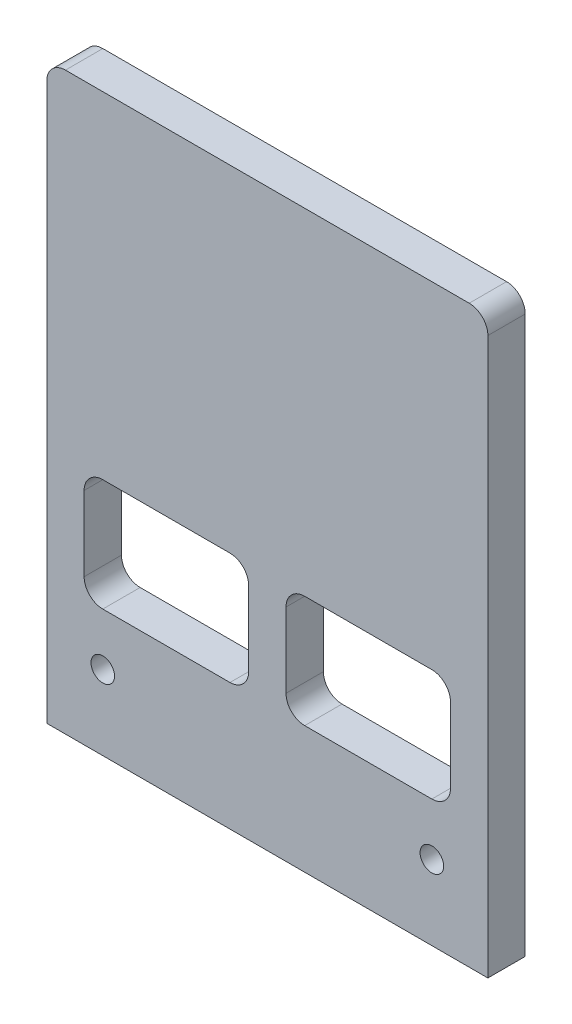
ISO-10303-21;
HEADER;
FILE_DESCRIPTION(('STEP AP214'),'2;1');
FILE_NAME('part.step','',(''),(''),'','','');
FILE_SCHEMA(('AUTOMOTIVE_DESIGN { 1 0 10303 214 1 1 1 1 }'));
ENDSEC;
DATA;
#1=APPLICATION_CONTEXT('core data for automotive mechanical design processes');
#2=APPLICATION_PROTOCOL_DEFINITION('international standard','automotive_design',2000,#1);
#3=PRODUCT_CONTEXT('',#1,'mechanical');
#4=PRODUCT('Part','Part','',(#3));
#5=PRODUCT_RELATED_PRODUCT_CATEGORY('part','',(#4));
#6=PRODUCT_DEFINITION_FORMATION('','',#4);
#7=PRODUCT_DEFINITION_CONTEXT('part definition',#1,'design');
#8=PRODUCT_DEFINITION('design','',#6,#7);
#9=PRODUCT_DEFINITION_SHAPE('','',#8);
#10=(LENGTH_UNIT() NAMED_UNIT(*) SI_UNIT(.MILLI.,.METRE.));
#11=(NAMED_UNIT(*) PLANE_ANGLE_UNIT() SI_UNIT($,.RADIAN.));
#12=(NAMED_UNIT(*) SI_UNIT($,.STERADIAN.) SOLID_ANGLE_UNIT());
#13=UNCERTAINTY_MEASURE_WITH_UNIT(LENGTH_MEASURE(1.E-05),#10,'distance_accuracy_value','');
#14=(GEOMETRIC_REPRESENTATION_CONTEXT(3) GLOBAL_UNCERTAINTY_ASSIGNED_CONTEXT((#13)) GLOBAL_UNIT_ASSIGNED_CONTEXT((#10,
#11,#12)) REPRESENTATION_CONTEXT('',''));
#15=CARTESIAN_POINT('',(0.,0.,0.));
#16=DIRECTION('',(0.,0.,1.));
#17=DIRECTION('',(1.,0.,0.));
#18=AXIS2_PLACEMENT_3D('',#15,#16,#17);
#19=CARTESIAN_POINT('',(37.5,-50.475000015,6.35));
#20=DIRECTION('',(-1.,0.,0.));
#21=DIRECTION('',(0.,0.,1.));
#22=AXIS2_PLACEMENT_3D('',#19,#20,#21);
#23=PLANE('',#22);
#24=DIRECTION('',(0.,1.,0.));
#25=VECTOR('',#24,1.);
#26=CARTESIAN_POINT('',(37.5,-50.475000015,0.));
#27=LINE('',#26,#25);
#28=CARTESIAN_POINT('',(37.5,-50.475000015,0.));
#29=VERTEX_POINT('',#28);
#30=CARTESIAN_POINT('',(37.5,44.125000015,0.));
#31=VERTEX_POINT('',#30);
#32=EDGE_CURVE('E225',#29,#31,#27,.T.);
#33=ORIENTED_EDGE('',*,*,#32,.T.);
#34=DIRECTION('',(0.,0.,-1.));
#35=VECTOR('',#34,1.);
#36=CARTESIAN_POINT('',(37.5,44.125000015,6.35));
#37=LINE('',#36,#35);
#38=CARTESIAN_POINT('',(37.5,44.125000015,6.35));
#39=VERTEX_POINT('',#38);
#40=EDGE_CURVE('E255',#31,#39,#37,.F.);
#41=ORIENTED_EDGE('',*,*,#40,.T.);
#42=DIRECTION('',(0.,1.,0.));
#43=VECTOR('',#42,1.);
#44=CARTESIAN_POINT('',(37.5,-50.475000015,6.35));
#45=LINE('',#44,#43);
#46=CARTESIAN_POINT('',(37.5,-50.475000015,6.35));
#47=VERTEX_POINT('',#46);
#48=EDGE_CURVE('E203',#47,#39,#45,.T.);
#49=ORIENTED_EDGE('',*,*,#48,.F.);
#50=DIRECTION('',(0.,0.,-1.));
#51=VECTOR('',#50,1.);
#52=CARTESIAN_POINT('',(37.5,-50.475000015,6.35));
#53=LINE('',#52,#51);
#54=EDGE_CURVE('E214',#47,#29,#53,.T.);
#55=ORIENTED_EDGE('',*,*,#54,.T.);
#56=EDGE_LOOP('',(#33,#41,#49,#55));
#57=FACE_BOUND('',#56,.T.);
#58=ADVANCED_FACE('F39',(#57),#23,.F.);
#59=CARTESIAN_POINT('',(-37.5,-50.475000015,6.35));
#60=DIRECTION('',(1.,0.,0.));
#61=DIRECTION('',(0.,0.,-1.));
#62=AXIS2_PLACEMENT_3D('',#59,#60,#61);
#63=PLANE('',#62);
#64=DIRECTION('',(0.,-1.,0.));
#65=VECTOR('',#64,1.);
#66=CARTESIAN_POINT('',(-37.5,-50.475000015,6.35));
#67=LINE('',#66,#65);
#68=CARTESIAN_POINT('',(-37.5,44.125000015,6.35));
#69=VERTEX_POINT('',#68);
#70=CARTESIAN_POINT('',(-37.5,-50.475000015,6.35));
#71=VERTEX_POINT('',#70);
#72=EDGE_CURVE('E189',#69,#71,#67,.T.);
#73=ORIENTED_EDGE('',*,*,#72,.F.);
#74=DIRECTION('',(0.,0.,-1.));
#75=VECTOR('',#74,1.);
#76=CARTESIAN_POINT('',(-37.5,44.125000015,6.35));
#77=LINE('',#76,#75);
#78=CARTESIAN_POINT('',(-37.5,44.125000015,0.));
#79=VERTEX_POINT('',#78);
#80=EDGE_CURVE('E213',#69,#79,#77,.T.);
#81=ORIENTED_EDGE('',*,*,#80,.T.);
#82=DIRECTION('',(0.,-1.,0.));
#83=VECTOR('',#82,1.);
#84=CARTESIAN_POINT('',(-37.5,-50.475000015,0.));
#85=LINE('',#84,#83);
#86=CARTESIAN_POINT('',(-37.5,-50.475000015,0.));
#87=VERTEX_POINT('',#86);
#88=EDGE_CURVE('E209',#79,#87,#85,.T.);
#89=ORIENTED_EDGE('',*,*,#88,.T.);
#90=DIRECTION('',(0.,0.,-1.));
#91=VECTOR('',#90,1.);
#92=CARTESIAN_POINT('',(-37.5,-50.475000015,6.35));
#93=LINE('',#92,#91);
#94=EDGE_CURVE('E206',#71,#87,#93,.T.);
#95=ORIENTED_EDGE('',*,*,#94,.F.);
#96=EDGE_LOOP('',(#73,#81,#89,#95));
#97=FACE_BOUND('',#96,.T.);
#98=ADVANCED_FACE('F207',(#97),#63,.F.);
#99=CARTESIAN_POINT('',(-37.5,-50.475000015,6.35));
#100=DIRECTION('',(0.,1.,0.));
#101=DIRECTION('',(0.,0.,1.));
#102=AXIS2_PLACEMENT_3D('',#99,#100,#101);
#103=PLANE('',#102);
#104=DIRECTION('',(1.,0.,0.));
#105=VECTOR('',#104,1.);
#106=CARTESIAN_POINT('',(-37.5,-50.475000015,0.));
#107=LINE('',#106,#105);
#108=EDGE_CURVE('E232',#87,#29,#107,.T.);
#109=ORIENTED_EDGE('',*,*,#108,.T.);
#110=ORIENTED_EDGE('',*,*,#54,.F.);
#111=DIRECTION('',(1.,0.,0.));
#112=VECTOR('',#111,1.);
#113=CARTESIAN_POINT('',(-37.5,-50.475000015,6.35));
#114=LINE('',#113,#112);
#115=EDGE_CURVE('E195',#71,#47,#114,.T.);
#116=ORIENTED_EDGE('',*,*,#115,.F.);
#117=ORIENTED_EDGE('',*,*,#94,.T.);
#118=EDGE_LOOP('',(#109,#110,#116,#117));
#119=FACE_BOUND('',#118,.T.);
#120=ADVANCED_FACE('F216',(#119),#103,.F.);
#121=CARTESIAN_POINT('',(0.,0.,6.35));
#122=DIRECTION('',(0.,0.,-1.));
#123=DIRECTION('',(-1.,0.,0.));
#124=AXIS2_PLACEMENT_3D('',#121,#122,#123);
#125=PLANE('',#124);
#126=DIRECTION('',(0.,1.,0.));
#127=VECTOR('',#126,1.);
#128=CARTESIAN_POINT('',(3.175,-9.83500001500001,6.35));
#129=LINE('',#128,#127);
#130=CARTESIAN_POINT('',(3.175,-25.710000015,6.35));
#131=VERTEX_POINT('',#130);
#132=CARTESIAN_POINT('',(3.175,-13.010000015,6.35));
#133=VERTEX_POINT('',#132);
#134=EDGE_CURVE('E381',#131,#133,#129,.T.);
#135=ORIENTED_EDGE('',*,*,#134,.T.);
#136=CARTESIAN_POINT('',(6.35,-13.010000015,6.35));
#137=DIRECTION('',(0.,0.,-1.));
#138=DIRECTION('',(-1.,0.,0.));
#139=AXIS2_PLACEMENT_3D('',#136,#137,#138);
#140=CIRCLE('',#139,3.175);
#141=CARTESIAN_POINT('',(6.35,-9.83500001500001,6.35));
#142=VERTEX_POINT('',#141);
#143=EDGE_CURVE('E346',#133,#142,#140,.T.);
#144=ORIENTED_EDGE('',*,*,#143,.T.);
#145=DIRECTION('',(1.,0.,0.));
#146=VECTOR('',#145,1.);
#147=CARTESIAN_POINT('',(31.15,-9.83500001500001,6.35));
#148=LINE('',#147,#146);
#149=CARTESIAN_POINT('',(27.975,-9.83500001500001,6.35));
#150=VERTEX_POINT('',#149);
#151=EDGE_CURVE('E385',#142,#150,#148,.T.);
#152=ORIENTED_EDGE('',*,*,#151,.T.);
#153=CARTESIAN_POINT('',(27.975,-13.010000015,6.35));
#154=DIRECTION('',(0.,0.,-1.));
#155=DIRECTION('',(-1.,0.,0.));
#156=AXIS2_PLACEMENT_3D('',#153,#154,#155);
#157=CIRCLE('',#156,3.175);
#158=CARTESIAN_POINT('',(31.15,-13.010000015,6.35));
#159=VERTEX_POINT('',#158);
#160=EDGE_CURVE('E62',#150,#159,#157,.T.);
#161=ORIENTED_EDGE('',*,*,#160,.T.);
#162=DIRECTION('',(0.,-1.,0.));
#163=VECTOR('',#162,1.);
#164=CARTESIAN_POINT('',(31.15,-9.83500001500001,6.35));
#165=LINE('',#164,#163);
#166=CARTESIAN_POINT('',(31.15,-25.710000015,6.35));
#167=VERTEX_POINT('',#166);
#168=EDGE_CURVE('E376',#159,#167,#165,.T.);
#169=ORIENTED_EDGE('',*,*,#168,.T.);
#170=CARTESIAN_POINT('',(27.975,-25.710000015,6.35));
#171=DIRECTION('',(0.,0.,-1.));
#172=DIRECTION('',(-1.,0.,0.));
#173=AXIS2_PLACEMENT_3D('',#170,#171,#172);
#174=CIRCLE('',#173,3.175);
#175=CARTESIAN_POINT('',(27.975,-28.885000015,6.35));
#176=VERTEX_POINT('',#175);
#177=EDGE_CURVE('E11',#167,#176,#174,.T.);
#178=ORIENTED_EDGE('',*,*,#177,.T.);
#179=DIRECTION('',(-1.,0.,0.));
#180=VECTOR('',#179,1.);
#181=CARTESIAN_POINT('',(31.15,-28.885000015,6.35));
#182=LINE('',#181,#180);
#183=CARTESIAN_POINT('',(6.35,-28.885000015,6.35));
#184=VERTEX_POINT('',#183);
#185=EDGE_CURVE('E374',#176,#184,#182,.T.);
#186=ORIENTED_EDGE('',*,*,#185,.T.);
#187=CARTESIAN_POINT('',(6.35,-25.710000015,6.35));
#188=DIRECTION('',(0.,0.,-1.));
#189=DIRECTION('',(-1.,0.,0.));
#190=AXIS2_PLACEMENT_3D('',#187,#188,#189);
#191=CIRCLE('',#190,3.175);
#192=EDGE_CURVE('E340',#184,#131,#191,.T.);
#193=ORIENTED_EDGE('',*,*,#192,.T.);
#194=EDGE_LOOP('',(#135,#144,#152,#161,#169,#178,#186,#193));
#195=FACE_BOUND('',#194,.T.);
#196=DIRECTION('',(0.,1.,0.));
#197=VECTOR('',#196,1.);
#198=CARTESIAN_POINT('',(-31.15,-9.83500001500001,6.35));
#199=LINE('',#198,#197);
#200=CARTESIAN_POINT('',(-31.15,-25.710000015,6.35));
#201=VERTEX_POINT('',#200);
#202=CARTESIAN_POINT('',(-31.15,-13.010000015,6.35));
#203=VERTEX_POINT('',#202);
#204=EDGE_CURVE('E411',#201,#203,#199,.T.);
#205=ORIENTED_EDGE('',*,*,#204,.T.);
#206=CARTESIAN_POINT('',(-27.975,-13.010000015,6.35));
#207=DIRECTION('',(0.,0.,-1.));
#208=DIRECTION('',(-1.,0.,0.));
#209=AXIS2_PLACEMENT_3D('',#206,#207,#208);
#210=CIRCLE('',#209,3.175);
#211=CARTESIAN_POINT('',(-27.975,-9.83500001500001,6.35));
#212=VERTEX_POINT('',#211);
#213=EDGE_CURVE('E322',#203,#212,#210,.T.);
#214=ORIENTED_EDGE('',*,*,#213,.T.);
#215=DIRECTION('',(1.,0.,0.));
#216=VECTOR('',#215,1.);
#217=CARTESIAN_POINT('',(-3.175,-9.83500001500001,6.35));
#218=LINE('',#217,#216);
#219=CARTESIAN_POINT('',(-6.35,-9.83500001500001,6.35));
#220=VERTEX_POINT('',#219);
#221=EDGE_CURVE('E367',#212,#220,#218,.T.);
#222=ORIENTED_EDGE('',*,*,#221,.T.);
#223=CARTESIAN_POINT('',(-6.35,-13.010000015,6.35));
#224=DIRECTION('',(0.,0.,-1.));
#225=DIRECTION('',(-1.,0.,0.));
#226=AXIS2_PLACEMENT_3D('',#223,#224,#225);
#227=CIRCLE('',#226,3.175);
#228=CARTESIAN_POINT('',(-3.175,-13.010000015,6.35));
#229=VERTEX_POINT('',#228);
#230=EDGE_CURVE('E328',#220,#229,#227,.T.);
#231=ORIENTED_EDGE('',*,*,#230,.T.);
#232=DIRECTION('',(0.,-1.,0.));
#233=VECTOR('',#232,1.);
#234=CARTESIAN_POINT('',(-3.175,-9.83500001500001,6.35));
#235=LINE('',#234,#233);
#236=CARTESIAN_POINT('',(-3.175,-25.710000015,6.35));
#237=VERTEX_POINT('',#236);
#238=EDGE_CURVE('E402',#229,#237,#235,.T.);
#239=ORIENTED_EDGE('',*,*,#238,.T.);
#240=CARTESIAN_POINT('',(-6.35,-25.710000015,6.35));
#241=DIRECTION('',(0.,0.,-1.));
#242=DIRECTION('',(-1.,0.,0.));
#243=AXIS2_PLACEMENT_3D('',#240,#241,#242);
#244=CIRCLE('',#243,3.175);
#245=CARTESIAN_POINT('',(-6.35,-28.885000015,6.35));
#246=VERTEX_POINT('',#245);
#247=EDGE_CURVE('E334',#237,#246,#244,.T.);
#248=ORIENTED_EDGE('',*,*,#247,.T.);
#249=DIRECTION('',(-1.,0.,0.));
#250=VECTOR('',#249,1.);
#251=CARTESIAN_POINT('',(-3.175,-28.885000015,6.35));
#252=LINE('',#251,#250);
#253=CARTESIAN_POINT('',(-27.975,-28.885000015,6.35));
#254=VERTEX_POINT('',#253);
#255=EDGE_CURVE('E406',#246,#254,#252,.T.);
#256=ORIENTED_EDGE('',*,*,#255,.T.);
#257=CARTESIAN_POINT('',(-27.975,-25.710000015,6.35));
#258=DIRECTION('',(0.,0.,-1.));
#259=DIRECTION('',(-1.,0.,0.));
#260=AXIS2_PLACEMENT_3D('',#257,#258,#259);
#261=CIRCLE('',#260,3.175);
#262=EDGE_CURVE('E316',#254,#201,#261,.T.);
#263=ORIENTED_EDGE('',*,*,#262,.T.);
#264=EDGE_LOOP('',(#205,#214,#222,#231,#239,#248,#256,#263));
#265=FACE_BOUND('',#264,.T.);
#266=CARTESIAN_POINT('',(-27.975,-37.775000015,6.35));
#267=DIRECTION('',(0.,0.,1.));
#268=DIRECTION('',(1.,0.,0.));
#269=AXIS2_PLACEMENT_3D('',#266,#267,#268);
#270=CIRCLE('',#269,2.);
#271=CARTESIAN_POINT('',(-25.975,-37.775000015,6.35));
#272=VERTEX_POINT('',#271);
#273=EDGE_CURVE('E443',#272,#272,#270,.T.);
#274=ORIENTED_EDGE('',*,*,#273,.F.);
#275=EDGE_LOOP('',(#274));
#276=FACE_BOUND('',#275,.T.);
#277=CARTESIAN_POINT('',(27.975,-37.775000015,6.35));
#278=DIRECTION('',(0.,0.,1.));
#279=DIRECTION('',(1.,0.,0.));
#280=AXIS2_PLACEMENT_3D('',#277,#278,#279);
#281=CIRCLE('',#280,2.);
#282=CARTESIAN_POINT('',(29.975,-37.775000015,6.35));
#283=VERTEX_POINT('',#282);
#284=EDGE_CURVE('E436',#283,#283,#281,.T.);
#285=ORIENTED_EDGE('',*,*,#284,.F.);
#286=EDGE_LOOP('',(#285));
#287=FACE_BOUND('',#286,.T.);
#288=DIRECTION('',(-1.,0.,0.));
#289=VECTOR('',#288,1.);
#290=CARTESIAN_POINT('',(0.,47.300000015,6.35));
#291=LINE('',#290,#289);
#292=CARTESIAN_POINT('',(34.325,47.300000015,6.35));
#293=VERTEX_POINT('',#292);
#294=CARTESIAN_POINT('',(-34.325,47.300000015,6.35));
#295=VERTEX_POINT('',#294);
#296=EDGE_CURVE('E433',#293,#295,#291,.T.);
#297=ORIENTED_EDGE('',*,*,#296,.T.);
#298=CARTESIAN_POINT('',(-34.325,44.125000015,6.35));
#299=DIRECTION('',(0.,0.,-1.));
#300=DIRECTION('',(-1.,0.,0.));
#301=AXIS2_PLACEMENT_3D('',#298,#299,#300);
#302=CIRCLE('',#301,3.175);
#303=EDGE_CURVE('E198',#295,#69,#302,.F.);
#304=ORIENTED_EDGE('',*,*,#303,.T.);
#305=ORIENTED_EDGE('',*,*,#72,.T.);
#306=ORIENTED_EDGE('',*,*,#115,.T.);
#307=ORIENTED_EDGE('',*,*,#48,.T.);
#308=CARTESIAN_POINT('',(34.325,44.125000015,6.35));
#309=DIRECTION('',(0.,0.,-1.));
#310=DIRECTION('',(-1.,0.,0.));
#311=AXIS2_PLACEMENT_3D('',#308,#309,#310);
#312=CIRCLE('',#311,3.175);
#313=EDGE_CURVE('E250',#39,#293,#312,.F.);
#314=ORIENTED_EDGE('',*,*,#313,.T.);
#315=EDGE_LOOP('',(#297,#304,#305,#306,#307,#314));
#316=FACE_BOUND('',#315,.T.);
#317=ADVANCED_FACE('F192',(#195,#265,#276,#287,#316),#125,.F.);
#318=CARTESIAN_POINT('',(0.,0.,0.));
#319=DIRECTION('',(0.,0.,-1.));
#320=DIRECTION('',(-1.,0.,0.));
#321=AXIS2_PLACEMENT_3D('',#318,#319,#320);
#322=PLANE('',#321);
#323=DIRECTION('',(0.,-1.,0.));
#324=VECTOR('',#323,1.);
#325=CARTESIAN_POINT('',(31.15,-9.83500001500001,0.));
#326=LINE('',#325,#324);
#327=CARTESIAN_POINT('',(31.15,-13.010000015,0.));
#328=VERTEX_POINT('',#327);
#329=CARTESIAN_POINT('',(31.15,-25.710000015,0.));
#330=VERTEX_POINT('',#329);
#331=EDGE_CURVE('E359',#328,#330,#326,.T.);
#332=ORIENTED_EDGE('',*,*,#331,.F.);
#333=CARTESIAN_POINT('',(27.975,-13.010000015,0.));
#334=DIRECTION('',(0.,0.,-1.));
#335=DIRECTION('',(-1.,0.,0.));
#336=AXIS2_PLACEMENT_3D('',#333,#334,#335);
#337=CIRCLE('',#336,3.175);
#338=CARTESIAN_POINT('',(27.975,-9.83500001500001,0.));
#339=VERTEX_POINT('',#338);
#340=EDGE_CURVE('E349',#328,#339,#337,.F.);
#341=ORIENTED_EDGE('',*,*,#340,.T.);
#342=DIRECTION('',(1.,0.,0.));
#343=VECTOR('',#342,1.);
#344=CARTESIAN_POINT('',(31.15,-9.83500001500001,0.));
#345=LINE('',#344,#343);
#346=CARTESIAN_POINT('',(6.35,-9.83500001500001,0.));
#347=VERTEX_POINT('',#346);
#348=EDGE_CURVE('E387',#347,#339,#345,.T.);
#349=ORIENTED_EDGE('',*,*,#348,.F.);
#350=CARTESIAN_POINT('',(6.35,-13.010000015,0.));
#351=DIRECTION('',(0.,0.,-1.));
#352=DIRECTION('',(-1.,0.,0.));
#353=AXIS2_PLACEMENT_3D('',#350,#351,#352);
#354=CIRCLE('',#353,3.175);
#355=CARTESIAN_POINT('',(3.175,-13.010000015,0.));
#356=VERTEX_POINT('',#355);
#357=EDGE_CURVE('E343',#347,#356,#354,.F.);
#358=ORIENTED_EDGE('',*,*,#357,.T.);
#359=DIRECTION('',(0.,1.,0.));
#360=VECTOR('',#359,1.);
#361=CARTESIAN_POINT('',(3.175,-9.83500001500001,0.));
#362=LINE('',#361,#360);
#363=CARTESIAN_POINT('',(3.175,-25.710000015,0.));
#364=VERTEX_POINT('',#363);
#365=EDGE_CURVE('E395',#364,#356,#362,.T.);
#366=ORIENTED_EDGE('',*,*,#365,.F.);
#367=CARTESIAN_POINT('',(6.35,-25.710000015,0.));
#368=DIRECTION('',(0.,0.,-1.));
#369=DIRECTION('',(-1.,0.,0.));
#370=AXIS2_PLACEMENT_3D('',#367,#368,#369);
#371=CIRCLE('',#370,3.175);
#372=CARTESIAN_POINT('',(6.35,-28.885000015,0.));
#373=VERTEX_POINT('',#372);
#374=EDGE_CURVE('E337',#364,#373,#371,.F.);
#375=ORIENTED_EDGE('',*,*,#374,.T.);
#376=DIRECTION('',(-1.,0.,0.));
#377=VECTOR('',#376,1.);
#378=CARTESIAN_POINT('',(31.15,-28.885000015,0.));
#379=LINE('',#378,#377);
#380=CARTESIAN_POINT('',(27.975,-28.885000015,0.));
#381=VERTEX_POINT('',#380);
#382=EDGE_CURVE('E361',#381,#373,#379,.T.);
#383=ORIENTED_EDGE('',*,*,#382,.F.);
#384=CARTESIAN_POINT('',(27.975,-25.710000015,0.));
#385=DIRECTION('',(0.,0.,-1.));
#386=DIRECTION('',(-1.,0.,0.));
#387=AXIS2_PLACEMENT_3D('',#384,#385,#386);
#388=CIRCLE('',#387,3.175);
#389=EDGE_CURVE('E48',#381,#330,#388,.F.);
#390=ORIENTED_EDGE('',*,*,#389,.T.);
#391=EDGE_LOOP('',(#332,#341,#349,#358,#366,#375,#383,#390));
#392=FACE_BOUND('',#391,.T.);
#393=DIRECTION('',(0.,-1.,0.));
#394=VECTOR('',#393,1.);
#395=CARTESIAN_POINT('',(-3.175,-9.83500001500001,0.));
#396=LINE('',#395,#394);
#397=CARTESIAN_POINT('',(-3.175,-13.010000015,0.));
#398=VERTEX_POINT('',#397);
#399=CARTESIAN_POINT('',(-3.175,-25.710000015,0.));
#400=VERTEX_POINT('',#399);
#401=EDGE_CURVE('E418',#398,#400,#396,.T.);
#402=ORIENTED_EDGE('',*,*,#401,.F.);
#403=CARTESIAN_POINT('',(-6.35,-13.010000015,0.));
#404=DIRECTION('',(0.,0.,-1.));
#405=DIRECTION('',(-1.,0.,0.));
#406=AXIS2_PLACEMENT_3D('',#403,#404,#405);
#407=CIRCLE('',#406,3.175);
#408=CARTESIAN_POINT('',(-6.35,-9.83500001500001,0.));
#409=VERTEX_POINT('',#408);
#410=EDGE_CURVE('E325',#398,#409,#407,.F.);
#411=ORIENTED_EDGE('',*,*,#410,.T.);
#412=DIRECTION('',(1.,0.,0.));
#413=VECTOR('',#412,1.);
#414=CARTESIAN_POINT('',(-3.175,-9.83500001500001,0.));
#415=LINE('',#414,#413);
#416=CARTESIAN_POINT('',(-27.975,-9.83500001500001,0.));
#417=VERTEX_POINT('',#416);
#418=EDGE_CURVE('E407',#417,#409,#415,.T.);
#419=ORIENTED_EDGE('',*,*,#418,.F.);
#420=CARTESIAN_POINT('',(-27.975,-13.010000015,0.));
#421=DIRECTION('',(0.,0.,-1.));
#422=DIRECTION('',(-1.,0.,0.));
#423=AXIS2_PLACEMENT_3D('',#420,#421,#422);
#424=CIRCLE('',#423,3.175);
#425=CARTESIAN_POINT('',(-31.15,-13.010000015,0.));
#426=VERTEX_POINT('',#425);
#427=EDGE_CURVE('E319',#417,#426,#424,.F.);
#428=ORIENTED_EDGE('',*,*,#427,.T.);
#429=DIRECTION('',(0.,1.,0.));
#430=VECTOR('',#429,1.);
#431=CARTESIAN_POINT('',(-31.15,-9.83500001500001,0.));
#432=LINE('',#431,#430);
#433=CARTESIAN_POINT('',(-31.15,-25.710000015,0.));
#434=VERTEX_POINT('',#433);
#435=EDGE_CURVE('E426',#434,#426,#432,.T.);
#436=ORIENTED_EDGE('',*,*,#435,.F.);
#437=CARTESIAN_POINT('',(-27.975,-25.710000015,0.));
#438=DIRECTION('',(0.,0.,-1.));
#439=DIRECTION('',(-1.,0.,0.));
#440=AXIS2_PLACEMENT_3D('',#437,#438,#439);
#441=CIRCLE('',#440,3.175);
#442=CARTESIAN_POINT('',(-27.975,-28.885000015,0.));
#443=VERTEX_POINT('',#442);
#444=EDGE_CURVE('E313',#434,#443,#441,.F.);
#445=ORIENTED_EDGE('',*,*,#444,.T.);
#446=DIRECTION('',(-1.,0.,0.));
#447=VECTOR('',#446,1.);
#448=CARTESIAN_POINT('',(-3.175,-28.885000015,0.));
#449=LINE('',#448,#447);
#450=CARTESIAN_POINT('',(-6.35,-28.885000015,0.));
#451=VERTEX_POINT('',#450);
#452=EDGE_CURVE('E422',#451,#443,#449,.T.);
#453=ORIENTED_EDGE('',*,*,#452,.F.);
#454=CARTESIAN_POINT('',(-6.35,-25.710000015,0.));
#455=DIRECTION('',(0.,0.,-1.));
#456=DIRECTION('',(-1.,0.,0.));
#457=AXIS2_PLACEMENT_3D('',#454,#455,#456);
#458=CIRCLE('',#457,3.175);
#459=EDGE_CURVE('E331',#451,#400,#458,.F.);
#460=ORIENTED_EDGE('',*,*,#459,.T.);
#461=EDGE_LOOP('',(#402,#411,#419,#428,#436,#445,#453,#460));
#462=FACE_BOUND('',#461,.T.);
#463=ORIENTED_EDGE('',*,*,#88,.F.);
#464=CARTESIAN_POINT('',(-34.325,44.125000015,0.));
#465=DIRECTION('',(0.,0.,-1.));
#466=DIRECTION('',(-1.,0.,0.));
#467=AXIS2_PLACEMENT_3D('',#464,#465,#466);
#468=CIRCLE('',#467,3.175);
#469=CARTESIAN_POINT('',(-34.325,47.300000015,0.));
#470=VERTEX_POINT('',#469);
#471=EDGE_CURVE('E240',#79,#470,#468,.T.);
#472=ORIENTED_EDGE('',*,*,#471,.T.);
#473=DIRECTION('',(-1.,0.,0.));
#474=VECTOR('',#473,1.);
#475=CARTESIAN_POINT('',(0.,47.300000015,0.));
#476=LINE('',#475,#474);
#477=CARTESIAN_POINT('',(34.325,47.300000015,0.));
#478=VERTEX_POINT('',#477);
#479=EDGE_CURVE('E391',#478,#470,#476,.T.);
#480=ORIENTED_EDGE('',*,*,#479,.F.);
#481=CARTESIAN_POINT('',(34.325,44.125000015,0.));
#482=DIRECTION('',(0.,0.,-1.));
#483=DIRECTION('',(-1.,0.,0.));
#484=AXIS2_PLACEMENT_3D('',#481,#482,#483);
#485=CIRCLE('',#484,3.175);
#486=EDGE_CURVE('E237',#478,#31,#485,.T.);
#487=ORIENTED_EDGE('',*,*,#486,.T.);
#488=ORIENTED_EDGE('',*,*,#32,.F.);
#489=ORIENTED_EDGE('',*,*,#108,.F.);
#490=EDGE_LOOP('',(#463,#472,#480,#487,#488,#489));
#491=FACE_BOUND('',#490,.T.);
#492=CARTESIAN_POINT('',(-27.975,-37.775000015,0.));
#493=DIRECTION('',(0.,0.,1.));
#494=DIRECTION('',(1.,0.,0.));
#495=AXIS2_PLACEMENT_3D('',#492,#493,#494);
#496=CIRCLE('',#495,2.);
#497=CARTESIAN_POINT('',(-25.975,-37.775000015,0.));
#498=VERTEX_POINT('',#497);
#499=EDGE_CURVE('E229',#498,#498,#496,.T.);
#500=ORIENTED_EDGE('',*,*,#499,.T.);
#501=EDGE_LOOP('',(#500));
#502=FACE_BOUND('',#501,.T.);
#503=CARTESIAN_POINT('',(27.975,-37.775000015,0.));
#504=DIRECTION('',(0.,0.,1.));
#505=DIRECTION('',(1.,0.,0.));
#506=AXIS2_PLACEMENT_3D('',#503,#504,#505);
#507=CIRCLE('',#506,2.);
#508=CARTESIAN_POINT('',(29.975,-37.775000015,0.));
#509=VERTEX_POINT('',#508);
#510=EDGE_CURVE('E447',#509,#509,#507,.T.);
#511=ORIENTED_EDGE('',*,*,#510,.T.);
#512=EDGE_LOOP('',(#511));
#513=FACE_BOUND('',#512,.T.);
#514=ADVANCED_FACE('F357',(#392,#462,#491,#502,#513),#322,.T.);
#515=CARTESIAN_POINT('',(27.975,-37.775000015,0.));
#516=DIRECTION('',(0.,0.,1.));
#517=DIRECTION('',(1.,0.,0.));
#518=AXIS2_PLACEMENT_3D('',#515,#516,#517);
#519=CYLINDRICAL_SURFACE('',#518,2.);
#520=ORIENTED_EDGE('',*,*,#510,.F.);
#521=EDGE_LOOP('',(#520));
#522=FACE_BOUND('',#521,.T.);
#523=ORIENTED_EDGE('',*,*,#284,.T.);
#524=EDGE_LOOP('',(#523));
#525=FACE_BOUND('',#524,.T.);
#526=ADVANCED_FACE('F491',(#522,#525),#519,.F.);
#527=CARTESIAN_POINT('',(-27.975,-37.775000015,0.));
#528=DIRECTION('',(0.,0.,1.));
#529=DIRECTION('',(1.,0.,0.));
#530=AXIS2_PLACEMENT_3D('',#527,#528,#529);
#531=CYLINDRICAL_SURFACE('',#530,2.);
#532=ORIENTED_EDGE('',*,*,#499,.F.);
#533=EDGE_LOOP('',(#532));
#534=FACE_BOUND('',#533,.T.);
#535=ORIENTED_EDGE('',*,*,#273,.T.);
#536=EDGE_LOOP('',(#535));
#537=FACE_BOUND('',#536,.T.);
#538=ADVANCED_FACE('F478',(#534,#537),#531,.F.);
#539=CARTESIAN_POINT('',(0.,47.300000015,6.35));
#540=DIRECTION('',(0.,-1.,0.));
#541=DIRECTION('',(0.,0.,-1.));
#542=AXIS2_PLACEMENT_3D('',#539,#540,#541);
#543=PLANE('',#542);
#544=ORIENTED_EDGE('',*,*,#479,.T.);
#545=DIRECTION('',(0.,0.,-1.));
#546=VECTOR('',#545,1.);
#547=CARTESIAN_POINT('',(-34.325,47.300000015,6.35));
#548=LINE('',#547,#546);
#549=EDGE_CURVE('E247',#470,#295,#548,.F.);
#550=ORIENTED_EDGE('',*,*,#549,.T.);
#551=ORIENTED_EDGE('',*,*,#296,.F.);
#552=DIRECTION('',(0.,0.,-1.));
#553=VECTOR('',#552,1.);
#554=CARTESIAN_POINT('',(34.325,47.300000015,6.35));
#555=LINE('',#554,#553);
#556=EDGE_CURVE('E243',#293,#478,#555,.T.);
#557=ORIENTED_EDGE('',*,*,#556,.T.);
#558=EDGE_LOOP('',(#544,#550,#551,#557));
#559=FACE_BOUND('',#558,.T.);
#560=ADVANCED_FACE('F463',(#559),#543,.F.);
#561=CARTESIAN_POINT('',(-34.325,44.125000015,6.35));
#562=DIRECTION('',(0.,0.,-1.));
#563=DIRECTION('',(-1.,0.,0.));
#564=AXIS2_PLACEMENT_3D('',#561,#562,#563);
#565=CYLINDRICAL_SURFACE('',#564,3.175);
#566=ORIENTED_EDGE('',*,*,#303,.F.);
#567=ORIENTED_EDGE('',*,*,#549,.F.);
#568=ORIENTED_EDGE('',*,*,#471,.F.);
#569=ORIENTED_EDGE('',*,*,#80,.F.);
#570=EDGE_LOOP('',(#566,#567,#568,#569));
#571=FACE_BOUND('',#570,.T.);
#572=ADVANCED_FACE('F469',(#571),#565,.T.);
#573=CARTESIAN_POINT('',(34.325,44.125000015,6.35));
#574=DIRECTION('',(0.,0.,-1.));
#575=DIRECTION('',(-1.,0.,0.));
#576=AXIS2_PLACEMENT_3D('',#573,#574,#575);
#577=CYLINDRICAL_SURFACE('',#576,3.175);
#578=ORIENTED_EDGE('',*,*,#313,.F.);
#579=ORIENTED_EDGE('',*,*,#40,.F.);
#580=ORIENTED_EDGE('',*,*,#486,.F.);
#581=ORIENTED_EDGE('',*,*,#556,.F.);
#582=EDGE_LOOP('',(#578,#579,#580,#581));
#583=FACE_BOUND('',#582,.T.);
#584=ADVANCED_FACE('F460',(#583),#577,.T.);
#585=CARTESIAN_POINT('',(-3.175,-9.83500001500001,6.35));
#586=DIRECTION('',(1.,0.,0.));
#587=DIRECTION('',(0.,1.,0.));
#588=AXIS2_PLACEMENT_3D('',#585,#586,#587);
#589=PLANE('',#588);
#590=ORIENTED_EDGE('',*,*,#238,.F.);
#591=DIRECTION('',(0.,0.,-1.));
#592=VECTOR('',#591,1.);
#593=CARTESIAN_POINT('',(-3.175,-13.010000015,0.));
#594=LINE('',#593,#592);
#595=EDGE_CURVE('E282',#229,#398,#594,.T.);
#596=ORIENTED_EDGE('',*,*,#595,.T.);
#597=ORIENTED_EDGE('',*,*,#401,.T.);
#598=DIRECTION('',(0.,0.,-1.));
#599=VECTOR('',#598,1.);
#600=CARTESIAN_POINT('',(-3.175,-25.710000015,6.35));
#601=LINE('',#600,#599);
#602=EDGE_CURVE('E279',#400,#237,#601,.F.);
#603=ORIENTED_EDGE('',*,*,#602,.T.);
#604=EDGE_LOOP('',(#590,#596,#597,#603));
#605=FACE_BOUND('',#604,.T.);
#606=ADVANCED_FACE('F476',(#605),#589,.F.);
#607=CARTESIAN_POINT('',(-3.175,-9.83500001500001,6.35));
#608=DIRECTION('',(0.,1.,0.));
#609=DIRECTION('',(0.,0.,1.));
#610=AXIS2_PLACEMENT_3D('',#607,#608,#609);
#611=PLANE('',#610);
#612=ORIENTED_EDGE('',*,*,#221,.F.);
#613=DIRECTION('',(0.,0.,-1.));
#614=VECTOR('',#613,1.);
#615=CARTESIAN_POINT('',(-27.975,-9.83500001500001,0.));
#616=LINE('',#615,#614);
#617=EDGE_CURVE('E275',#212,#417,#616,.T.);
#618=ORIENTED_EDGE('',*,*,#617,.T.);
#619=ORIENTED_EDGE('',*,*,#418,.T.);
#620=DIRECTION('',(0.,0.,-1.));
#621=VECTOR('',#620,1.);
#622=CARTESIAN_POINT('',(-6.35,-9.83500001500001,6.35));
#623=LINE('',#622,#621);
#624=EDGE_CURVE('E272',#409,#220,#623,.F.);
#625=ORIENTED_EDGE('',*,*,#624,.T.);
#626=EDGE_LOOP('',(#612,#618,#619,#625));
#627=FACE_BOUND('',#626,.T.);
#628=ADVANCED_FACE('F502',(#627),#611,.F.);
#629=CARTESIAN_POINT('',(-31.15,-9.83500001500001,6.35));
#630=DIRECTION('',(-1.,0.,0.));
#631=DIRECTION('',(0.,-1.,0.));
#632=AXIS2_PLACEMENT_3D('',#629,#630,#631);
#633=PLANE('',#632);
#634=ORIENTED_EDGE('',*,*,#204,.F.);
#635=DIRECTION('',(0.,0.,-1.));
#636=VECTOR('',#635,1.);
#637=CARTESIAN_POINT('',(-31.15,-25.710000015,0.));
#638=LINE('',#637,#636);
#639=EDGE_CURVE('E261',#201,#434,#638,.T.);
#640=ORIENTED_EDGE('',*,*,#639,.T.);
#641=ORIENTED_EDGE('',*,*,#435,.T.);
#642=DIRECTION('',(0.,0.,-1.));
#643=VECTOR('',#642,1.);
#644=CARTESIAN_POINT('',(-31.15,-13.010000015,6.35));
#645=LINE('',#644,#643);
#646=EDGE_CURVE('E258',#426,#203,#645,.F.);
#647=ORIENTED_EDGE('',*,*,#646,.T.);
#648=EDGE_LOOP('',(#634,#640,#641,#647));
#649=FACE_BOUND('',#648,.T.);
#650=ADVANCED_FACE('F507',(#649),#633,.F.);
#651=CARTESIAN_POINT('',(-3.175,-28.885000015,6.35));
#652=DIRECTION('',(0.,-1.,0.));
#653=DIRECTION('',(0.,0.,-1.));
#654=AXIS2_PLACEMENT_3D('',#651,#652,#653);
#655=PLANE('',#654);
#656=ORIENTED_EDGE('',*,*,#452,.T.);
#657=DIRECTION('',(0.,0.,-1.));
#658=VECTOR('',#657,1.);
#659=CARTESIAN_POINT('',(-27.975,-28.885000015,6.35));
#660=LINE('',#659,#658);
#661=EDGE_CURVE('E269',#443,#254,#660,.F.);
#662=ORIENTED_EDGE('',*,*,#661,.T.);
#663=ORIENTED_EDGE('',*,*,#255,.F.);
#664=DIRECTION('',(0.,0.,-1.));
#665=VECTOR('',#664,1.);
#666=CARTESIAN_POINT('',(-6.35,-28.885000015,0.));
#667=LINE('',#666,#665);
#668=EDGE_CURVE('E265',#246,#451,#667,.T.);
#669=ORIENTED_EDGE('',*,*,#668,.T.);
#670=EDGE_LOOP('',(#656,#662,#663,#669));
#671=FACE_BOUND('',#670,.T.);
#672=ADVANCED_FACE('F504',(#671),#655,.F.);
#673=CARTESIAN_POINT('',(31.15,-9.83500001500001,6.35));
#674=DIRECTION('',(1.,0.,0.));
#675=DIRECTION('',(0.,0.,-1.));
#676=AXIS2_PLACEMENT_3D('',#673,#674,#675);
#677=PLANE('',#676);
#678=ORIENTED_EDGE('',*,*,#168,.F.);
#679=DIRECTION('',(0.,0.,-1.));
#680=VECTOR('',#679,1.);
#681=CARTESIAN_POINT('',(31.15,-13.010000015,0.));
#682=LINE('',#681,#680);
#683=EDGE_CURVE('E309',#159,#328,#682,.T.);
#684=ORIENTED_EDGE('',*,*,#683,.T.);
#685=ORIENTED_EDGE('',*,*,#331,.T.);
#686=DIRECTION('',(0.,0.,-1.));
#687=VECTOR('',#686,1.);
#688=CARTESIAN_POINT('',(31.15,-25.710000015,6.35));
#689=LINE('',#688,#687);
#690=EDGE_CURVE('E55',#330,#167,#689,.F.);
#691=ORIENTED_EDGE('',*,*,#690,.T.);
#692=EDGE_LOOP('',(#678,#684,#685,#691));
#693=FACE_BOUND('',#692,.T.);
#694=ADVANCED_FACE('F364',(#693),#677,.F.);
#695=CARTESIAN_POINT('',(31.15,-9.83500001500001,6.35));
#696=DIRECTION('',(0.,1.,0.));
#697=DIRECTION('',(0.,0.,1.));
#698=AXIS2_PLACEMENT_3D('',#695,#696,#697);
#699=PLANE('',#698);
#700=ORIENTED_EDGE('',*,*,#151,.F.);
#701=DIRECTION('',(0.,0.,-1.));
#702=VECTOR('',#701,1.);
#703=CARTESIAN_POINT('',(6.35,-9.83500001500001,0.));
#704=LINE('',#703,#702);
#705=EDGE_CURVE('E303',#142,#347,#704,.T.);
#706=ORIENTED_EDGE('',*,*,#705,.T.);
#707=ORIENTED_EDGE('',*,*,#348,.T.);
#708=DIRECTION('',(0.,0.,-1.));
#709=VECTOR('',#708,1.);
#710=CARTESIAN_POINT('',(27.975,-9.83500001500001,6.35));
#711=LINE('',#710,#709);
#712=EDGE_CURVE('E300',#339,#150,#711,.F.);
#713=ORIENTED_EDGE('',*,*,#712,.T.);
#714=EDGE_LOOP('',(#700,#706,#707,#713));
#715=FACE_BOUND('',#714,.T.);
#716=ADVANCED_FACE('F517',(#715),#699,.F.);
#717=CARTESIAN_POINT('',(3.175,-9.83500001500001,6.35));
#718=DIRECTION('',(-1.,0.,0.));
#719=DIRECTION('',(0.,0.,1.));
#720=AXIS2_PLACEMENT_3D('',#717,#718,#719);
#721=PLANE('',#720);
#722=ORIENTED_EDGE('',*,*,#134,.F.);
#723=DIRECTION('',(0.,0.,-1.));
#724=VECTOR('',#723,1.);
#725=CARTESIAN_POINT('',(3.175,-25.710000015,0.));
#726=LINE('',#725,#724);
#727=EDGE_CURVE('E289',#131,#364,#726,.T.);
#728=ORIENTED_EDGE('',*,*,#727,.T.);
#729=ORIENTED_EDGE('',*,*,#365,.T.);
#730=DIRECTION('',(0.,0.,-1.));
#731=VECTOR('',#730,1.);
#732=CARTESIAN_POINT('',(3.175,-13.010000015,6.35));
#733=LINE('',#732,#731);
#734=EDGE_CURVE('E286',#356,#133,#733,.F.);
#735=ORIENTED_EDGE('',*,*,#734,.T.);
#736=EDGE_LOOP('',(#722,#728,#729,#735));
#737=FACE_BOUND('',#736,.T.);
#738=ADVANCED_FACE('F521',(#737),#721,.F.);
#739=CARTESIAN_POINT('',(31.15,-28.885000015,6.35));
#740=DIRECTION('',(0.,-1.,0.));
#741=DIRECTION('',(0.,0.,-1.));
#742=AXIS2_PLACEMENT_3D('',#739,#740,#741);
#743=PLANE('',#742);
#744=ORIENTED_EDGE('',*,*,#382,.T.);
#745=DIRECTION('',(0.,0.,-1.));
#746=VECTOR('',#745,1.);
#747=CARTESIAN_POINT('',(6.35,-28.885000015,6.35));
#748=LINE('',#747,#746);
#749=EDGE_CURVE('E297',#373,#184,#748,.F.);
#750=ORIENTED_EDGE('',*,*,#749,.T.);
#751=ORIENTED_EDGE('',*,*,#185,.F.);
#752=DIRECTION('',(0.,0.,-1.));
#753=VECTOR('',#752,1.);
#754=CARTESIAN_POINT('',(27.975,-28.885000015,0.));
#755=LINE('',#754,#753);
#756=EDGE_CURVE('E293',#176,#381,#755,.T.);
#757=ORIENTED_EDGE('',*,*,#756,.T.);
#758=EDGE_LOOP('',(#744,#750,#751,#757));
#759=FACE_BOUND('',#758,.T.);
#760=ADVANCED_FACE('F378',(#759),#743,.F.);
#761=CARTESIAN_POINT('',(-27.975,-25.710000015,6.35));
#762=DIRECTION('',(0.,0.,1.));
#763=DIRECTION('',(1.,0.,0.));
#764=AXIS2_PLACEMENT_3D('',#761,#762,#763);
#765=CYLINDRICAL_SURFACE('',#764,3.175);
#766=ORIENTED_EDGE('',*,*,#262,.F.);
#767=ORIENTED_EDGE('',*,*,#661,.F.);
#768=ORIENTED_EDGE('',*,*,#444,.F.);
#769=ORIENTED_EDGE('',*,*,#639,.F.);
#770=EDGE_LOOP('',(#766,#767,#768,#769));
#771=FACE_BOUND('',#770,.T.);
#772=ADVANCED_FACE('F520',(#771),#765,.F.);
#773=CARTESIAN_POINT('',(-27.975,-13.010000015,6.35));
#774=DIRECTION('',(0.,0.,1.));
#775=DIRECTION('',(1.,0.,0.));
#776=AXIS2_PLACEMENT_3D('',#773,#774,#775);
#777=CYLINDRICAL_SURFACE('',#776,3.175);
#778=ORIENTED_EDGE('',*,*,#213,.F.);
#779=ORIENTED_EDGE('',*,*,#646,.F.);
#780=ORIENTED_EDGE('',*,*,#427,.F.);
#781=ORIENTED_EDGE('',*,*,#617,.F.);
#782=EDGE_LOOP('',(#778,#779,#780,#781));
#783=FACE_BOUND('',#782,.T.);
#784=ADVANCED_FACE('F591',(#783),#777,.F.);
#785=CARTESIAN_POINT('',(-6.35,-13.010000015,6.35));
#786=DIRECTION('',(0.,0.,1.));
#787=DIRECTION('',(1.,0.,0.));
#788=AXIS2_PLACEMENT_3D('',#785,#786,#787);
#789=CYLINDRICAL_SURFACE('',#788,3.175);
#790=ORIENTED_EDGE('',*,*,#230,.F.);
#791=ORIENTED_EDGE('',*,*,#624,.F.);
#792=ORIENTED_EDGE('',*,*,#410,.F.);
#793=ORIENTED_EDGE('',*,*,#595,.F.);
#794=EDGE_LOOP('',(#790,#791,#792,#793));
#795=FACE_BOUND('',#794,.T.);
#796=ADVANCED_FACE('F551',(#795),#789,.F.);
#797=CARTESIAN_POINT('',(-6.35,-25.710000015,6.35));
#798=DIRECTION('',(0.,0.,1.));
#799=DIRECTION('',(1.,0.,0.));
#800=AXIS2_PLACEMENT_3D('',#797,#798,#799);
#801=CYLINDRICAL_SURFACE('',#800,3.175);
#802=ORIENTED_EDGE('',*,*,#247,.F.);
#803=ORIENTED_EDGE('',*,*,#602,.F.);
#804=ORIENTED_EDGE('',*,*,#459,.F.);
#805=ORIENTED_EDGE('',*,*,#668,.F.);
#806=EDGE_LOOP('',(#802,#803,#804,#805));
#807=FACE_BOUND('',#806,.T.);
#808=ADVANCED_FACE('F543',(#807),#801,.F.);
#809=CARTESIAN_POINT('',(6.35,-25.710000015,6.35));
#810=DIRECTION('',(0.,0.,1.));
#811=DIRECTION('',(1.,0.,0.));
#812=AXIS2_PLACEMENT_3D('',#809,#810,#811);
#813=CYLINDRICAL_SURFACE('',#812,3.175);
#814=ORIENTED_EDGE('',*,*,#192,.F.);
#815=ORIENTED_EDGE('',*,*,#749,.F.);
#816=ORIENTED_EDGE('',*,*,#374,.F.);
#817=ORIENTED_EDGE('',*,*,#727,.F.);
#818=EDGE_LOOP('',(#814,#815,#816,#817));
#819=FACE_BOUND('',#818,.T.);
#820=ADVANCED_FACE('F541',(#819),#813,.F.);
#821=CARTESIAN_POINT('',(6.35,-13.010000015,6.35));
#822=DIRECTION('',(0.,0.,1.));
#823=DIRECTION('',(1.,0.,0.));
#824=AXIS2_PLACEMENT_3D('',#821,#822,#823);
#825=CYLINDRICAL_SURFACE('',#824,3.175);
#826=ORIENTED_EDGE('',*,*,#143,.F.);
#827=ORIENTED_EDGE('',*,*,#734,.F.);
#828=ORIENTED_EDGE('',*,*,#357,.F.);
#829=ORIENTED_EDGE('',*,*,#705,.F.);
#830=EDGE_LOOP('',(#826,#827,#828,#829));
#831=FACE_BOUND('',#830,.T.);
#832=ADVANCED_FACE('F535',(#831),#825,.F.);
#833=CARTESIAN_POINT('',(27.975,-13.010000015,6.35));
#834=DIRECTION('',(0.,0.,1.));
#835=DIRECTION('',(1.,0.,0.));
#836=AXIS2_PLACEMENT_3D('',#833,#834,#835);
#837=CYLINDRICAL_SURFACE('',#836,3.175);
#838=ORIENTED_EDGE('',*,*,#160,.F.);
#839=ORIENTED_EDGE('',*,*,#712,.F.);
#840=ORIENTED_EDGE('',*,*,#340,.F.);
#841=ORIENTED_EDGE('',*,*,#683,.F.);
#842=EDGE_LOOP('',(#838,#839,#840,#841));
#843=FACE_BOUND('',#842,.T.);
#844=ADVANCED_FACE('F549',(#843),#837,.F.);
#845=CARTESIAN_POINT('',(27.975,-25.710000015,6.35));
#846=DIRECTION('',(0.,0.,1.));
#847=DIRECTION('',(1.,0.,0.));
#848=AXIS2_PLACEMENT_3D('',#845,#846,#847);
#849=CYLINDRICAL_SURFACE('',#848,3.175);
#850=ORIENTED_EDGE('',*,*,#177,.F.);
#851=ORIENTED_EDGE('',*,*,#690,.F.);
#852=ORIENTED_EDGE('',*,*,#389,.F.);
#853=ORIENTED_EDGE('',*,*,#756,.F.);
#854=EDGE_LOOP('',(#850,#851,#852,#853));
#855=FACE_BOUND('',#854,.T.);
#856=ADVANCED_FACE('F41',(#855),#849,.F.);
#857=CLOSED_SHELL('',(#58,#98,#120,#317,#514,#526,#538,#560,#572,#584,#606,#628,#650,#672,#694,
#716,#738,#760,#772,#784,#796,#808,#820,#832,#844,#856));
#858=MANIFOLD_SOLID_BREP('B2',#857);
#859=ADVANCED_BREP_SHAPE_REPRESENTATION('',(#18,#858),#14);
#860=SHAPE_DEFINITION_REPRESENTATION(#9,#859);
ENDSEC;
END-ISO-10303-21;
